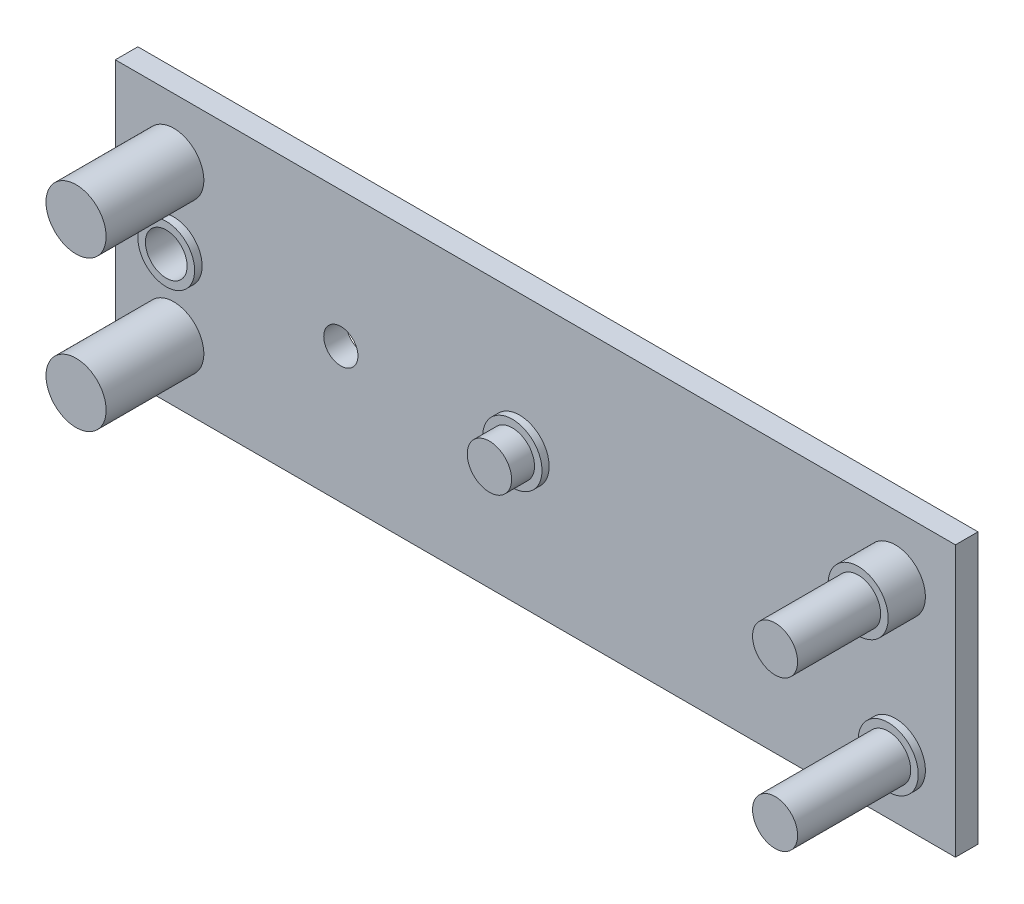
ISO-10303-21;
HEADER;
FILE_DESCRIPTION(('STEP AP214'),'2;1');
FILE_NAME('part.step','',(''),(''),'','','');
FILE_SCHEMA(('AUTOMOTIVE_DESIGN { 1 0 10303 214 1 1 1 1 }'));
ENDSEC;
DATA;
#1=APPLICATION_CONTEXT('core data for automotive mechanical design processes');
#2=APPLICATION_PROTOCOL_DEFINITION('international standard','automotive_design',2000,#1);
#3=PRODUCT_CONTEXT('',#1,'mechanical');
#4=PRODUCT('Part','Part','',(#3));
#5=PRODUCT_RELATED_PRODUCT_CATEGORY('part','',(#4));
#6=PRODUCT_DEFINITION_FORMATION('','',#4);
#7=PRODUCT_DEFINITION_CONTEXT('part definition',#1,'design');
#8=PRODUCT_DEFINITION('design','',#6,#7);
#9=PRODUCT_DEFINITION_SHAPE('','',#8);
#10=(LENGTH_UNIT() NAMED_UNIT(*) SI_UNIT(.MILLI.,.METRE.));
#11=(NAMED_UNIT(*) PLANE_ANGLE_UNIT() SI_UNIT($,.RADIAN.));
#12=(NAMED_UNIT(*) SI_UNIT($,.STERADIAN.) SOLID_ANGLE_UNIT());
#13=UNCERTAINTY_MEASURE_WITH_UNIT(LENGTH_MEASURE(1.E-05),#10,'distance_accuracy_value','');
#14=(GEOMETRIC_REPRESENTATION_CONTEXT(3) GLOBAL_UNCERTAINTY_ASSIGNED_CONTEXT((#13)) GLOBAL_UNIT_ASSIGNED_CONTEXT((#10,
#11,#12)) REPRESENTATION_CONTEXT('',''));
#15=CARTESIAN_POINT('',(0.,0.,0.));
#16=DIRECTION('',(0.,0.,1.));
#17=DIRECTION('',(1.,0.,0.));
#18=AXIS2_PLACEMENT_3D('',#15,#16,#17);
#19=CARTESIAN_POINT('',(0.,0.,3.));
#20=DIRECTION('',(0.,0.,1.));
#21=DIRECTION('',(1.,0.,0.));
#22=AXIS2_PLACEMENT_3D('',#19,#20,#21);
#23=PLANE('',#22);
#24=CARTESIAN_POINT('',(0.,10.,3.));
#25=DIRECTION('',(0.,0.,1.));
#26=DIRECTION('',(-1.,0.,0.));
#27=AXIS2_PLACEMENT_3D('',#24,#25,#26);
#28=CIRCLE('',#27,4.);
#29=CARTESIAN_POINT('',(-4.,10.,3.));
#30=VERTEX_POINT('',#29);
#31=EDGE_CURVE('E234',#30,#30,#28,.T.);
#32=ORIENTED_EDGE('',*,*,#31,.F.);
#33=EDGE_LOOP('',(#32));
#34=FACE_BOUND('',#33,.T.);
#35=CARTESIAN_POINT('',(0.,-10.,3.));
#36=DIRECTION('',(0.,0.,1.));
#37=DIRECTION('',(1.,0.,0.));
#38=AXIS2_PLACEMENT_3D('',#35,#36,#37);
#39=CIRCLE('',#38,4.);
#40=CARTESIAN_POINT('',(-4.,-10.,3.));
#41=VERTEX_POINT('',#40);
#42=EDGE_CURVE('E226',#41,#41,#39,.T.);
#43=ORIENTED_EDGE('',*,*,#42,.F.);
#44=EDGE_LOOP('',(#43));
#45=FACE_BOUND('',#44,.T.);
#46=DIRECTION('',(0.,-1.,0.));
#47=VECTOR('',#46,1.);
#48=CARTESIAN_POINT('',(-7.775,18.,3.));
#49=LINE('',#48,#47);
#50=CARTESIAN_POINT('',(-7.775,18.,3.));
#51=VERTEX_POINT('',#50);
#52=CARTESIAN_POINT('',(-7.775,-18.,3.));
#53=VERTEX_POINT('',#52);
#54=EDGE_CURVE('E100',#51,#53,#49,.T.);
#55=ORIENTED_EDGE('',*,*,#54,.T.);
#56=DIRECTION('',(1.,0.,0.));
#57=VECTOR('',#56,1.);
#58=CARTESIAN_POINT('',(-7.775,-18.,3.));
#59=LINE('',#58,#57);
#60=CARTESIAN_POINT('',(104.0099990002,-18.,3.));
#61=VERTEX_POINT('',#60);
#62=EDGE_CURVE('E95',#53,#61,#59,.T.);
#63=ORIENTED_EDGE('',*,*,#62,.T.);
#64=DIRECTION('',(0.,1.,0.));
#65=VECTOR('',#64,1.);
#66=CARTESIAN_POINT('',(104.0099990002,18.,3.));
#67=LINE('',#66,#65);
#68=CARTESIAN_POINT('',(104.0099990002,18.,3.));
#69=VERTEX_POINT('',#68);
#70=EDGE_CURVE('E98',#61,#69,#67,.T.);
#71=ORIENTED_EDGE('',*,*,#70,.T.);
#72=DIRECTION('',(-1.,0.,0.));
#73=VECTOR('',#72,1.);
#74=CARTESIAN_POINT('',(-7.775,18.,3.));
#75=LINE('',#74,#73);
#76=EDGE_CURVE('E65',#69,#51,#75,.T.);
#77=ORIENTED_EDGE('',*,*,#76,.T.);
#78=EDGE_LOOP('',(#55,#63,#71,#77));
#79=FACE_BOUND('',#78,.T.);
#80=CARTESIAN_POINT('',(46.,0.,3.));
#81=DIRECTION('',(0.,0.,1.));
#82=DIRECTION('',(1.,0.,0.));
#83=AXIS2_PLACEMENT_3D('',#80,#81,#82);
#84=CIRCLE('',#83,3.95);
#85=CARTESIAN_POINT('',(42.05,0.,3.));
#86=VERTEX_POINT('',#85);
#87=EDGE_CURVE('E141',#86,#86,#84,.T.);
#88=ORIENTED_EDGE('',*,*,#87,.F.);
#89=EDGE_LOOP('',(#88));
#90=FACE_BOUND('',#89,.T.);
#91=CARTESIAN_POINT('',(96.0099990002,-10.,3.));
#92=DIRECTION('',(0.,0.,1.));
#93=DIRECTION('',(1.,0.,0.));
#94=AXIS2_PLACEMENT_3D('',#91,#92,#93);
#95=CIRCLE('',#94,4.);
#96=CARTESIAN_POINT('',(92.0099990001999,-10.,3.));
#97=VERTEX_POINT('',#96);
#98=EDGE_CURVE('E151',#97,#97,#95,.T.);
#99=ORIENTED_EDGE('',*,*,#98,.F.);
#100=EDGE_LOOP('',(#99));
#101=FACE_BOUND('',#100,.T.);
#102=CARTESIAN_POINT('',(96.0099990002,10.,3.));
#103=DIRECTION('',(0.,0.,1.));
#104=DIRECTION('',(1.,0.,0.));
#105=AXIS2_PLACEMENT_3D('',#102,#103,#104);
#106=CIRCLE('',#105,4.);
#107=CARTESIAN_POINT('',(92.0099990001999,10.,3.));
#108=VERTEX_POINT('',#107);
#109=EDGE_CURVE('E160',#108,#108,#106,.T.);
#110=ORIENTED_EDGE('',*,*,#109,.F.);
#111=EDGE_LOOP('',(#110));
#112=FACE_BOUND('',#111,.T.);
#113=CARTESIAN_POINT('',(22.23,0.,3.));
#114=DIRECTION('',(0.,0.,1.));
#115=DIRECTION('',(1.,0.,0.));
#116=AXIS2_PLACEMENT_3D('',#113,#114,#115);
#117=CIRCLE('',#116,2.275);
#118=CARTESIAN_POINT('',(24.505,0.,3.));
#119=VERTEX_POINT('',#118);
#120=EDGE_CURVE('E205',#119,#119,#117,.F.);
#121=ORIENTED_EDGE('',*,*,#120,.T.);
#122=EDGE_LOOP('',(#121));
#123=FACE_BOUND('',#122,.T.);
#124=CARTESIAN_POINT('',(0.,0.,3.));
#125=DIRECTION('',(0.,0.,1.));
#126=DIRECTION('',(1.,0.,0.));
#127=AXIS2_PLACEMENT_3D('',#124,#125,#126);
#128=CIRCLE('',#127,3.775);
#129=CARTESIAN_POINT('',(3.775,0.,3.));
#130=VERTEX_POINT('',#129);
#131=EDGE_CURVE('E214',#130,#130,#128,.T.);
#132=ORIENTED_EDGE('',*,*,#131,.F.);
#133=EDGE_LOOP('',(#132));
#134=FACE_BOUND('',#133,.T.);
#135=ADVANCED_FACE('F45',(#34,#45,#79,#90,#101,#112,#123,#134),#23,.T.);
#136=CARTESIAN_POINT('',(0.,0.,0.));
#137=DIRECTION('',(0.,0.,1.));
#138=DIRECTION('',(1.,0.,0.));
#139=AXIS2_PLACEMENT_3D('',#136,#137,#138);
#140=PLANE('',#139);
#141=CARTESIAN_POINT('',(22.23,0.,0.));
#142=DIRECTION('',(0.,0.,-1.));
#143=DIRECTION('',(-1.,0.,0.));
#144=AXIS2_PLACEMENT_3D('',#141,#142,#143);
#145=CIRCLE('',#144,2.275);
#146=CARTESIAN_POINT('',(19.955,0.,0.));
#147=VERTEX_POINT('',#146);
#148=EDGE_CURVE('E202',#147,#147,#145,.T.);
#149=ORIENTED_EDGE('',*,*,#148,.F.);
#150=EDGE_LOOP('',(#149));
#151=FACE_BOUND('',#150,.T.);
#152=DIRECTION('',(0.,-1.,0.));
#153=VECTOR('',#152,1.);
#154=CARTESIAN_POINT('',(-7.775,18.,0.));
#155=LINE('',#154,#153);
#156=CARTESIAN_POINT('',(-7.775,18.,0.));
#157=VERTEX_POINT('',#156);
#158=CARTESIAN_POINT('',(-7.775,-18.,0.));
#159=VERTEX_POINT('',#158);
#160=EDGE_CURVE('E118',#157,#159,#155,.T.);
#161=ORIENTED_EDGE('',*,*,#160,.F.);
#162=DIRECTION('',(-1.,0.,0.));
#163=VECTOR('',#162,1.);
#164=CARTESIAN_POINT('',(-7.775,18.,0.));
#165=LINE('',#164,#163);
#166=CARTESIAN_POINT('',(104.0099990002,18.,0.));
#167=VERTEX_POINT('',#166);
#168=EDGE_CURVE('E88',#167,#157,#165,.T.);
#169=ORIENTED_EDGE('',*,*,#168,.F.);
#170=DIRECTION('',(0.,1.,0.));
#171=VECTOR('',#170,1.);
#172=CARTESIAN_POINT('',(104.0099990002,18.,0.));
#173=LINE('',#172,#171);
#174=CARTESIAN_POINT('',(104.0099990002,-18.,0.));
#175=VERTEX_POINT('',#174);
#176=EDGE_CURVE('E82',#175,#167,#173,.T.);
#177=ORIENTED_EDGE('',*,*,#176,.F.);
#178=DIRECTION('',(1.,0.,0.));
#179=VECTOR('',#178,1.);
#180=CARTESIAN_POINT('',(-7.775,-18.,0.));
#181=LINE('',#180,#179);
#182=EDGE_CURVE('E105',#159,#175,#181,.T.);
#183=ORIENTED_EDGE('',*,*,#182,.F.);
#184=EDGE_LOOP('',(#161,#169,#177,#183));
#185=FACE_BOUND('',#184,.T.);
#186=CARTESIAN_POINT('',(0.,0.,0.));
#187=DIRECTION('',(0.,0.,1.));
#188=DIRECTION('',(1.,0.,0.));
#189=AXIS2_PLACEMENT_3D('',#186,#187,#188);
#190=CIRCLE('',#189,2.775);
#191=CARTESIAN_POINT('',(2.775,0.,0.));
#192=VERTEX_POINT('',#191);
#193=EDGE_CURVE('E122',#192,#192,#190,.T.);
#194=ORIENTED_EDGE('',*,*,#193,.T.);
#195=EDGE_LOOP('',(#194));
#196=FACE_BOUND('',#195,.T.);
#197=ADVANCED_FACE('F257',(#151,#185,#196),#140,.F.);
#198=CARTESIAN_POINT('',(-7.775,18.,3.));
#199=DIRECTION('',(1.,0.,0.));
#200=DIRECTION('',(0.,0.,-1.));
#201=AXIS2_PLACEMENT_3D('',#198,#199,#200);
#202=PLANE('',#201);
#203=ORIENTED_EDGE('',*,*,#160,.T.);
#204=DIRECTION('',(0.,0.,-1.));
#205=VECTOR('',#204,1.);
#206=CARTESIAN_POINT('',(-7.775,-18.,3.));
#207=LINE('',#206,#205);
#208=EDGE_CURVE('E11',#53,#159,#207,.T.);
#209=ORIENTED_EDGE('',*,*,#208,.F.);
#210=ORIENTED_EDGE('',*,*,#54,.F.);
#211=DIRECTION('',(0.,0.,-1.));
#212=VECTOR('',#211,1.);
#213=CARTESIAN_POINT('',(-7.775,18.,3.));
#214=LINE('',#213,#212);
#215=EDGE_CURVE('E114',#51,#157,#214,.T.);
#216=ORIENTED_EDGE('',*,*,#215,.T.);
#217=EDGE_LOOP('',(#203,#209,#210,#216));
#218=FACE_BOUND('',#217,.T.);
#219=ADVANCED_FACE('F47',(#218),#202,.F.);
#220=CARTESIAN_POINT('',(-7.775,-18.,3.));
#221=DIRECTION('',(0.,1.,0.));
#222=DIRECTION('',(0.,0.,1.));
#223=AXIS2_PLACEMENT_3D('',#220,#221,#222);
#224=PLANE('',#223);
#225=ORIENTED_EDGE('',*,*,#182,.T.);
#226=DIRECTION('',(0.,0.,-1.));
#227=VECTOR('',#226,1.);
#228=CARTESIAN_POINT('',(104.0099990002,-18.,3.));
#229=LINE('',#228,#227);
#230=EDGE_CURVE('E56',#61,#175,#229,.T.);
#231=ORIENTED_EDGE('',*,*,#230,.F.);
#232=ORIENTED_EDGE('',*,*,#62,.F.);
#233=ORIENTED_EDGE('',*,*,#208,.T.);
#234=EDGE_LOOP('',(#225,#231,#232,#233));
#235=FACE_BOUND('',#234,.T.);
#236=ADVANCED_FACE('F104',(#235),#224,.F.);
#237=CARTESIAN_POINT('',(104.0099990002,18.,3.));
#238=DIRECTION('',(-1.,0.,0.));
#239=DIRECTION('',(0.,0.,1.));
#240=AXIS2_PLACEMENT_3D('',#237,#238,#239);
#241=PLANE('',#240);
#242=ORIENTED_EDGE('',*,*,#176,.T.);
#243=DIRECTION('',(0.,0.,-1.));
#244=VECTOR('',#243,1.);
#245=CARTESIAN_POINT('',(104.0099990002,18.,3.));
#246=LINE('',#245,#244);
#247=EDGE_CURVE('E107',#69,#167,#246,.T.);
#248=ORIENTED_EDGE('',*,*,#247,.F.);
#249=ORIENTED_EDGE('',*,*,#70,.F.);
#250=ORIENTED_EDGE('',*,*,#230,.T.);
#251=EDGE_LOOP('',(#242,#248,#249,#250));
#252=FACE_BOUND('',#251,.T.);
#253=ADVANCED_FACE('F109',(#252),#241,.F.);
#254=CARTESIAN_POINT('',(-7.775,18.,3.));
#255=DIRECTION('',(0.,-1.,0.));
#256=DIRECTION('',(0.,0.,-1.));
#257=AXIS2_PLACEMENT_3D('',#254,#255,#256);
#258=PLANE('',#257);
#259=ORIENTED_EDGE('',*,*,#168,.T.);
#260=ORIENTED_EDGE('',*,*,#215,.F.);
#261=ORIENTED_EDGE('',*,*,#76,.F.);
#262=ORIENTED_EDGE('',*,*,#247,.T.);
#263=EDGE_LOOP('',(#259,#260,#261,#262));
#264=FACE_BOUND('',#263,.T.);
#265=ADVANCED_FACE('F333',(#264),#258,.F.);
#266=CARTESIAN_POINT('',(0.,0.,3.));
#267=DIRECTION('',(0.,0.,-1.));
#268=DIRECTION('',(-1.,0.,0.));
#269=AXIS2_PLACEMENT_3D('',#266,#267,#268);
#270=CYLINDRICAL_SURFACE('',#269,2.775);
#271=ORIENTED_EDGE('',*,*,#193,.F.);
#272=EDGE_LOOP('',(#271));
#273=FACE_BOUND('',#272,.T.);
#274=CARTESIAN_POINT('',(0.,0.,4.));
#275=DIRECTION('',(0.,0.,1.));
#276=DIRECTION('',(1.,0.,0.));
#277=AXIS2_PLACEMENT_3D('',#274,#275,#276);
#278=CIRCLE('',#277,2.775);
#279=CARTESIAN_POINT('',(2.775,0.,4.));
#280=VERTEX_POINT('',#279);
#281=EDGE_CURVE('E218',#280,#280,#278,.T.);
#282=ORIENTED_EDGE('',*,*,#281,.T.);
#283=EDGE_LOOP('',(#282));
#284=FACE_BOUND('',#283,.T.);
#285=ADVANCED_FACE('F313',(#273,#284),#270,.F.);
#286=CARTESIAN_POINT('',(46.,0.,3.95));
#287=DIRECTION('',(0.,0.,-1.));
#288=DIRECTION('',(-1.,0.,0.));
#289=AXIS2_PLACEMENT_3D('',#286,#287,#288);
#290=CYLINDRICAL_SURFACE('',#289,3.95);
#291=CARTESIAN_POINT('',(46.,0.,3.95));
#292=DIRECTION('',(0.,0.,1.));
#293=DIRECTION('',(1.,0.,0.));
#294=AXIS2_PLACEMENT_3D('',#291,#292,#293);
#295=CIRCLE('',#294,3.95);
#296=CARTESIAN_POINT('',(42.05,0.,3.95));
#297=VERTEX_POINT('',#296);
#298=EDGE_CURVE('E137',#297,#297,#295,.T.);
#299=CARTESIAN_POINT('',(42.05,0.,3.95));
#300=CARTESIAN_POINT('',(42.05,0.,3.94010416666667));
#301=CARTESIAN_POINT('',(42.05,0.,3.93020833333333));
#302=CARTESIAN_POINT('',(42.05,0.,3.91041666666667));
#303=CARTESIAN_POINT('',(42.05,0.,3.90052083333333));
#304=CARTESIAN_POINT('',(42.05,0.,3.88072916666667));
#305=CARTESIAN_POINT('',(42.05,0.,3.87083333333333));
#306=CARTESIAN_POINT('',(42.05,0.,3.85104166666667));
#307=CARTESIAN_POINT('',(42.05,0.,3.84114583333333));
#308=CARTESIAN_POINT('',(42.05,0.,3.82135416666667));
#309=CARTESIAN_POINT('',(42.05,0.,3.81145833333333));
#310=CARTESIAN_POINT('',(42.05,0.,3.79166666666667));
#311=CARTESIAN_POINT('',(42.05,0.,3.78177083333333));
#312=CARTESIAN_POINT('',(42.05,0.,3.76197916666667));
#313=CARTESIAN_POINT('',(42.05,0.,3.75208333333333));
#314=CARTESIAN_POINT('',(42.05,0.,3.73229166666667));
#315=CARTESIAN_POINT('',(42.05,0.,3.72239583333333));
#316=CARTESIAN_POINT('',(42.05,0.,3.70260416666667));
#317=CARTESIAN_POINT('',(42.05,0.,3.69270833333333));
#318=CARTESIAN_POINT('',(42.05,0.,3.67291666666667));
#319=CARTESIAN_POINT('',(42.05,0.,3.66302083333333));
#320=CARTESIAN_POINT('',(42.05,0.,3.64322916666667));
#321=CARTESIAN_POINT('',(42.05,0.,3.63333333333333));
#322=CARTESIAN_POINT('',(42.05,0.,3.61354166666667));
#323=CARTESIAN_POINT('',(42.05,0.,3.60364583333333));
#324=CARTESIAN_POINT('',(42.05,0.,3.58385416666667));
#325=CARTESIAN_POINT('',(42.05,0.,3.57395833333333));
#326=CARTESIAN_POINT('',(42.05,0.,3.55416666666667));
#327=CARTESIAN_POINT('',(42.05,0.,3.54427083333333));
#328=CARTESIAN_POINT('',(42.05,0.,3.52447916666667));
#329=CARTESIAN_POINT('',(42.05,0.,3.51458333333333));
#330=CARTESIAN_POINT('',(42.05,0.,3.49479166666667));
#331=CARTESIAN_POINT('',(42.05,0.,3.48489583333333));
#332=CARTESIAN_POINT('',(42.05,0.,3.46510416666667));
#333=CARTESIAN_POINT('',(42.05,0.,3.45520833333333));
#334=CARTESIAN_POINT('',(42.05,0.,3.43541666666667));
#335=CARTESIAN_POINT('',(42.05,0.,3.42552083333333));
#336=CARTESIAN_POINT('',(42.05,0.,3.40572916666667));
#337=CARTESIAN_POINT('',(42.05,0.,3.39583333333333));
#338=CARTESIAN_POINT('',(42.05,0.,3.37604166666667));
#339=CARTESIAN_POINT('',(42.05,0.,3.36614583333333));
#340=CARTESIAN_POINT('',(42.05,0.,3.34635416666667));
#341=CARTESIAN_POINT('',(42.05,0.,3.33645833333333));
#342=CARTESIAN_POINT('',(42.05,0.,3.31666666666667));
#343=CARTESIAN_POINT('',(42.05,0.,3.30677083333333));
#344=CARTESIAN_POINT('',(42.05,0.,3.28697916666667));
#345=CARTESIAN_POINT('',(42.05,0.,3.27708333333333));
#346=CARTESIAN_POINT('',(42.05,0.,3.25729166666667));
#347=CARTESIAN_POINT('',(42.05,0.,3.24739583333333));
#348=CARTESIAN_POINT('',(42.05,0.,3.22760416666667));
#349=CARTESIAN_POINT('',(42.05,0.,3.21770833333333));
#350=CARTESIAN_POINT('',(42.05,0.,3.19791666666667));
#351=CARTESIAN_POINT('',(42.05,0.,3.18802083333333));
#352=CARTESIAN_POINT('',(42.05,0.,3.16822916666667));
#353=CARTESIAN_POINT('',(42.05,0.,3.15833333333333));
#354=CARTESIAN_POINT('',(42.05,0.,3.13854166666667));
#355=CARTESIAN_POINT('',(42.05,0.,3.12864583333333));
#356=CARTESIAN_POINT('',(42.05,0.,3.10885416666667));
#357=CARTESIAN_POINT('',(42.05,0.,3.09895833333333));
#358=CARTESIAN_POINT('',(42.05,0.,3.07916666666667));
#359=CARTESIAN_POINT('',(42.05,0.,3.06927083333333));
#360=CARTESIAN_POINT('',(42.05,0.,3.04947916666667));
#361=CARTESIAN_POINT('',(42.05,0.,3.03958333333333));
#362=CARTESIAN_POINT('',(42.05,0.,3.01979166666667));
#363=CARTESIAN_POINT('',(42.05,0.,3.00989583333333));
#364=CARTESIAN_POINT('',(42.05,0.,3.));
#365=B_SPLINE_CURVE_WITH_KNOTS('',3,(#299,#300,#301,#302,#303,#304,#305,#306,#307,#308,#309,
#310,#311,#312,#313,#314,#315,#316,#317,#318,#319,#320,#321,#322,#323,#324,#325,#326,#327,#328,
#329,#330,#331,#332,#333,#334,#335,#336,#337,#338,#339,#340,#341,#342,#343,#344,#345,#346,#347,
#348,#349,#350,#351,#352,#353,#354,#355,#356,#357,#358,#359,#360,#361,#362,#363,#364),
.UNSPECIFIED.,.F.,.F.,(4,2,2,2,2,2,2,2,2,2,2,2,2,2,2,2,2,2,2,2,2,2,2,2,2,2,2,2,2,2,2,2,4),(0.,
0.0296874999999993,0.0593749999999995,0.0890624999999997,0.118749999999999,0.1484375,
0.178124999999999,0.2078125,0.237499999999999,0.2671875,0.296874999999999,0.3265625,0.35625,
0.3859375,0.415625,0.4453125,0.475,0.5046875,0.534375,0.564062499999999,0.59375,0.6234375,
0.653125,0.6828125,0.7125,0.7421875,0.771875,0.8015625,0.831249999999999,0.8609375,0.890625,
0.9203125,0.95),.UNSPECIFIED.);
#366=EDGE_CURVE('BSEAM309',#297,#86,#365,.T.);
#367=ORIENTED_EDGE('',*,*,#298,.F.);
#368=ORIENTED_EDGE('',*,*,#87,.T.);
#369=ORIENTED_EDGE('',*,*,#366,.T.);
#370=ORIENTED_EDGE('',*,*,#366,.F.);
#371=EDGE_LOOP('',(#367,#369,#368,#370));
#372=FACE_BOUND('',#371,.T.);
#373=ADVANCED_FACE('F309',(#372),#290,.T.);
#374=CARTESIAN_POINT('',(46.,0.,3.95));
#375=DIRECTION('',(0.,0.,1.));
#376=DIRECTION('',(1.,0.,0.));
#377=AXIS2_PLACEMENT_3D('',#374,#375,#376);
#378=PLANE('',#377);
#379=CARTESIAN_POINT('',(46.,0.,3.95));
#380=DIRECTION('',(0.,0.,1.));
#381=DIRECTION('',(1.,0.,0.));
#382=AXIS2_PLACEMENT_3D('',#379,#380,#381);
#383=CIRCLE('',#382,2.95);
#384=CARTESIAN_POINT('',(48.95,0.,3.95));
#385=VERTEX_POINT('',#384);
#386=EDGE_CURVE('E133',#385,#385,#383,.T.);
#387=ORIENTED_EDGE('',*,*,#386,.F.);
#388=EDGE_LOOP('',(#387));
#389=FACE_BOUND('',#388,.T.);
#390=ORIENTED_EDGE('',*,*,#298,.T.);
#391=EDGE_LOOP('',(#390));
#392=FACE_BOUND('',#391,.T.);
#393=ADVANCED_FACE('F305',(#389,#392),#378,.T.);
#394=CARTESIAN_POINT('',(46.,0.,7.));
#395=DIRECTION('',(0.,0.,1.));
#396=DIRECTION('',(1.,0.,0.));
#397=AXIS2_PLACEMENT_3D('',#394,#395,#396);
#398=PLANE('',#397);
#399=CARTESIAN_POINT('',(46.,0.,7.));
#400=DIRECTION('',(0.,0.,1.));
#401=DIRECTION('',(1.,0.,0.));
#402=AXIS2_PLACEMENT_3D('',#399,#400,#401);
#403=CIRCLE('',#402,2.95);
#404=CARTESIAN_POINT('',(48.95,0.,7.));
#405=VERTEX_POINT('',#404);
#406=EDGE_CURVE('E136',#405,#405,#403,.T.);
#407=ORIENTED_EDGE('',*,*,#406,.T.);
#408=EDGE_LOOP('',(#407));
#409=FACE_BOUND('',#408,.T.);
#410=ADVANCED_FACE('F308',(#409),#398,.T.);
#411=CARTESIAN_POINT('',(46.,0.,7.));
#412=DIRECTION('',(0.,0.,-1.));
#413=DIRECTION('',(-1.,0.,0.));
#414=AXIS2_PLACEMENT_3D('',#411,#412,#413);
#415=CYLINDRICAL_SURFACE('',#414,2.95);
#416=ORIENTED_EDGE('',*,*,#386,.T.);
#417=EDGE_LOOP('',(#416));
#418=FACE_BOUND('',#417,.T.);
#419=ORIENTED_EDGE('',*,*,#406,.F.);
#420=EDGE_LOOP('',(#419));
#421=FACE_BOUND('',#420,.T.);
#422=ADVANCED_FACE('F303',(#418,#421),#415,.T.);
#423=CARTESIAN_POINT('',(96.0099990002,-10.,3.95));
#424=DIRECTION('',(0.,0.,-1.));
#425=DIRECTION('',(-1.,0.,0.));
#426=AXIS2_PLACEMENT_3D('',#423,#424,#425);
#427=CYLINDRICAL_SURFACE('',#426,4.);
#428=CARTESIAN_POINT('',(96.0099990002,-10.,3.95));
#429=DIRECTION('',(0.,0.,1.));
#430=DIRECTION('',(1.,0.,0.));
#431=AXIS2_PLACEMENT_3D('',#428,#429,#430);
#432=CIRCLE('',#431,4.);
#433=CARTESIAN_POINT('',(92.0099990001999,-10.,3.95));
#434=VERTEX_POINT('',#433);
#435=EDGE_CURVE('E142',#434,#434,#432,.T.);
#436=CARTESIAN_POINT('',(92.0099990001999,-10.,3.95));
#437=CARTESIAN_POINT('',(92.0099990001999,-10.,3.94010416666667));
#438=CARTESIAN_POINT('',(92.0099990001999,-10.,3.93020833333333));
#439=CARTESIAN_POINT('',(92.0099990001999,-10.,3.91041666666667));
#440=CARTESIAN_POINT('',(92.0099990001999,-10.,3.90052083333333));
#441=CARTESIAN_POINT('',(92.0099990001999,-10.,3.88072916666667));
#442=CARTESIAN_POINT('',(92.0099990001999,-10.,3.87083333333333));
#443=CARTESIAN_POINT('',(92.0099990001999,-10.,3.85104166666667));
#444=CARTESIAN_POINT('',(92.0099990001999,-10.,3.84114583333333));
#445=CARTESIAN_POINT('',(92.0099990001999,-10.,3.82135416666667));
#446=CARTESIAN_POINT('',(92.0099990001999,-10.,3.81145833333333));
#447=CARTESIAN_POINT('',(92.0099990001999,-10.,3.79166666666667));
#448=CARTESIAN_POINT('',(92.0099990001999,-10.,3.78177083333333));
#449=CARTESIAN_POINT('',(92.0099990001999,-10.,3.76197916666667));
#450=CARTESIAN_POINT('',(92.0099990001999,-10.,3.75208333333333));
#451=CARTESIAN_POINT('',(92.0099990001999,-10.,3.73229166666667));
#452=CARTESIAN_POINT('',(92.0099990001999,-10.,3.72239583333333));
#453=CARTESIAN_POINT('',(92.0099990001999,-10.,3.70260416666667));
#454=CARTESIAN_POINT('',(92.0099990001999,-10.,3.69270833333333));
#455=CARTESIAN_POINT('',(92.0099990001999,-10.,3.67291666666667));
#456=CARTESIAN_POINT('',(92.0099990001999,-10.,3.66302083333333));
#457=CARTESIAN_POINT('',(92.0099990001999,-10.,3.64322916666667));
#458=CARTESIAN_POINT('',(92.0099990001999,-10.,3.63333333333333));
#459=CARTESIAN_POINT('',(92.0099990001999,-10.,3.61354166666667));
#460=CARTESIAN_POINT('',(92.0099990001999,-10.,3.60364583333333));
#461=CARTESIAN_POINT('',(92.0099990001999,-10.,3.58385416666667));
#462=CARTESIAN_POINT('',(92.0099990001999,-10.,3.57395833333333));
#463=CARTESIAN_POINT('',(92.0099990001999,-10.,3.55416666666667));
#464=CARTESIAN_POINT('',(92.0099990001999,-10.,3.54427083333333));
#465=CARTESIAN_POINT('',(92.0099990001999,-10.,3.52447916666667));
#466=CARTESIAN_POINT('',(92.0099990001999,-10.,3.51458333333333));
#467=CARTESIAN_POINT('',(92.0099990001999,-10.,3.49479166666667));
#468=CARTESIAN_POINT('',(92.0099990001999,-10.,3.48489583333333));
#469=CARTESIAN_POINT('',(92.0099990001999,-10.,3.46510416666667));
#470=CARTESIAN_POINT('',(92.0099990001999,-10.,3.45520833333333));
#471=CARTESIAN_POINT('',(92.0099990001999,-10.,3.43541666666667));
#472=CARTESIAN_POINT('',(92.0099990001999,-10.,3.42552083333333));
#473=CARTESIAN_POINT('',(92.0099990001999,-10.,3.40572916666667));
#474=CARTESIAN_POINT('',(92.0099990001999,-10.,3.39583333333333));
#475=CARTESIAN_POINT('',(92.0099990001999,-10.,3.37604166666667));
#476=CARTESIAN_POINT('',(92.0099990001999,-10.,3.36614583333333));
#477=CARTESIAN_POINT('',(92.0099990001999,-10.,3.34635416666667));
#478=CARTESIAN_POINT('',(92.0099990001999,-10.,3.33645833333333));
#479=CARTESIAN_POINT('',(92.0099990001999,-10.,3.31666666666667));
#480=CARTESIAN_POINT('',(92.0099990001999,-10.,3.30677083333333));
#481=CARTESIAN_POINT('',(92.0099990001999,-10.,3.28697916666667));
#482=CARTESIAN_POINT('',(92.0099990001999,-10.,3.27708333333333));
#483=CARTESIAN_POINT('',(92.0099990001999,-10.,3.25729166666667));
#484=CARTESIAN_POINT('',(92.0099990001999,-10.,3.24739583333333));
#485=CARTESIAN_POINT('',(92.0099990001999,-10.,3.22760416666667));
#486=CARTESIAN_POINT('',(92.0099990001999,-10.,3.21770833333333));
#487=CARTESIAN_POINT('',(92.0099990001999,-10.,3.19791666666667));
#488=CARTESIAN_POINT('',(92.0099990001999,-10.,3.18802083333333));
#489=CARTESIAN_POINT('',(92.0099990001999,-10.,3.16822916666667));
#490=CARTESIAN_POINT('',(92.0099990001999,-10.,3.15833333333333));
#491=CARTESIAN_POINT('',(92.0099990001999,-10.,3.13854166666667));
#492=CARTESIAN_POINT('',(92.0099990001999,-10.,3.12864583333333));
#493=CARTESIAN_POINT('',(92.0099990001999,-10.,3.10885416666667));
#494=CARTESIAN_POINT('',(92.0099990001999,-10.,3.09895833333333));
#495=CARTESIAN_POINT('',(92.0099990001999,-10.,3.07916666666667));
#496=CARTESIAN_POINT('',(92.0099990001999,-10.,3.06927083333333));
#497=CARTESIAN_POINT('',(92.0099990001999,-10.,3.04947916666667));
#498=CARTESIAN_POINT('',(92.0099990001999,-10.,3.03958333333333));
#499=CARTESIAN_POINT('',(92.0099990001999,-10.,3.01979166666667));
#500=CARTESIAN_POINT('',(92.0099990001999,-10.,3.00989583333333));
#501=CARTESIAN_POINT('',(92.0099990001999,-10.,3.));
#502=B_SPLINE_CURVE_WITH_KNOTS('',3,(#436,#437,#438,#439,#440,#441,#442,#443,#444,#445,#446,
#447,#448,#449,#450,#451,#452,#453,#454,#455,#456,#457,#458,#459,#460,#461,#462,#463,#464,#465,
#466,#467,#468,#469,#470,#471,#472,#473,#474,#475,#476,#477,#478,#479,#480,#481,#482,#483,#484,
#485,#486,#487,#488,#489,#490,#491,#492,#493,#494,#495,#496,#497,#498,#499,#500,#501),
.UNSPECIFIED.,.F.,.F.,(4,2,2,2,2,2,2,2,2,2,2,2,2,2,2,2,2,2,2,2,2,2,2,2,2,2,2,2,2,2,2,2,4),(0.,
0.0296874999999993,0.0593749999999995,0.0890624999999997,0.118749999999999,0.1484375,
0.178124999999999,0.2078125,0.237499999999999,0.2671875,0.296874999999999,0.3265625,0.35625,
0.3859375,0.415625,0.4453125,0.475,0.5046875,0.534375,0.564062499999999,0.59375,0.6234375,
0.653125,0.6828125,0.7125,0.7421875,0.771875,0.8015625,0.831249999999999,0.8609375,0.890625,
0.9203125,0.95),.UNSPECIFIED.);
#503=EDGE_CURVE('BSEAM299',#434,#97,#502,.T.);
#504=ORIENTED_EDGE('',*,*,#435,.F.);
#505=ORIENTED_EDGE('',*,*,#98,.T.);
#506=ORIENTED_EDGE('',*,*,#503,.T.);
#507=ORIENTED_EDGE('',*,*,#503,.F.);
#508=EDGE_LOOP('',(#504,#506,#505,#507));
#509=FACE_BOUND('',#508,.T.);
#510=ADVANCED_FACE('F299',(#509),#427,.T.);
#511=CARTESIAN_POINT('',(96.0099990002,-10.,3.95));
#512=DIRECTION('',(0.,0.,1.));
#513=DIRECTION('',(1.,0.,0.));
#514=AXIS2_PLACEMENT_3D('',#511,#512,#513);
#515=PLANE('',#514);
#516=CARTESIAN_POINT('',(96.0099990002,-10.,3.95));
#517=DIRECTION('',(0.,0.,1.));
#518=DIRECTION('',(1.,0.,0.));
#519=AXIS2_PLACEMENT_3D('',#516,#517,#518);
#520=CIRCLE('',#519,3.00000000000001);
#521=CARTESIAN_POINT('',(99.0099990002,-10.,3.95));
#522=VERTEX_POINT('',#521);
#523=EDGE_CURVE('E138',#522,#522,#520,.T.);
#524=ORIENTED_EDGE('',*,*,#523,.F.);
#525=EDGE_LOOP('',(#524));
#526=FACE_BOUND('',#525,.T.);
#527=ORIENTED_EDGE('',*,*,#435,.T.);
#528=EDGE_LOOP('',(#527));
#529=FACE_BOUND('',#528,.T.);
#530=ADVANCED_FACE('F295',(#526,#529),#515,.T.);
#531=CARTESIAN_POINT('',(96.0099990002,-10.,19.));
#532=DIRECTION('',(0.,0.,1.));
#533=DIRECTION('',(1.,0.,0.));
#534=AXIS2_PLACEMENT_3D('',#531,#532,#533);
#535=PLANE('',#534);
#536=CARTESIAN_POINT('',(96.0099990002,-10.,19.));
#537=DIRECTION('',(0.,0.,1.));
#538=DIRECTION('',(1.,0.,0.));
#539=AXIS2_PLACEMENT_3D('',#536,#537,#538);
#540=CIRCLE('',#539,3.00000000000001);
#541=CARTESIAN_POINT('',(99.0099990002,-10.,19.));
#542=VERTEX_POINT('',#541);
#543=EDGE_CURVE('E173',#542,#542,#540,.T.);
#544=ORIENTED_EDGE('',*,*,#543,.T.);
#545=EDGE_LOOP('',(#544));
#546=FACE_BOUND('',#545,.T.);
#547=ADVANCED_FACE('F298',(#546),#535,.T.);
#548=CARTESIAN_POINT('',(96.0099990002,-10.,19.));
#549=DIRECTION('',(0.,0.,-1.));
#550=DIRECTION('',(-1.,0.,0.));
#551=AXIS2_PLACEMENT_3D('',#548,#549,#550);
#552=CYLINDRICAL_SURFACE('',#551,3.00000000000001);
#553=ORIENTED_EDGE('',*,*,#523,.T.);
#554=EDGE_LOOP('',(#553));
#555=FACE_BOUND('',#554,.T.);
#556=ORIENTED_EDGE('',*,*,#543,.F.);
#557=EDGE_LOOP('',(#556));
#558=FACE_BOUND('',#557,.T.);
#559=ADVANCED_FACE('F293',(#555,#558),#552,.T.);
#560=CARTESIAN_POINT('',(96.0099990002,10.,7.95));
#561=DIRECTION('',(0.,0.,-1.));
#562=DIRECTION('',(-1.,0.,0.));
#563=AXIS2_PLACEMENT_3D('',#560,#561,#562);
#564=CYLINDRICAL_SURFACE('',#563,4.);
#565=CARTESIAN_POINT('',(96.0099990002,10.,7.95));
#566=DIRECTION('',(0.,0.,1.));
#567=DIRECTION('',(1.,0.,0.));
#568=AXIS2_PLACEMENT_3D('',#565,#566,#567);
#569=CIRCLE('',#568,4.);
#570=CARTESIAN_POINT('',(92.0099990001999,10.,7.95));
#571=VERTEX_POINT('',#570);
#572=EDGE_CURVE('E242',#571,#571,#569,.T.);
#573=CARTESIAN_POINT('',(92.0099990001999,10.,7.95));
#574=CARTESIAN_POINT('',(92.0099990001999,10.,7.8984375));
#575=CARTESIAN_POINT('',(92.0099990001999,10.,7.846875));
#576=CARTESIAN_POINT('',(92.0099990001999,10.,7.74375));
#577=CARTESIAN_POINT('',(92.0099990001999,10.,7.6921875));
#578=CARTESIAN_POINT('',(92.0099990001999,10.,7.5890625));
#579=CARTESIAN_POINT('',(92.0099990001999,10.,7.5375));
#580=CARTESIAN_POINT('',(92.0099990001999,10.,7.434375));
#581=CARTESIAN_POINT('',(92.0099990001999,10.,7.3828125));
#582=CARTESIAN_POINT('',(92.0099990001999,10.,7.2796875));
#583=CARTESIAN_POINT('',(92.0099990001999,10.,7.228125));
#584=CARTESIAN_POINT('',(92.0099990001999,10.,7.125));
#585=CARTESIAN_POINT('',(92.0099990001999,10.,7.0734375));
#586=CARTESIAN_POINT('',(92.0099990001999,10.,6.9703125));
#587=CARTESIAN_POINT('',(92.0099990001999,10.,6.91875));
#588=CARTESIAN_POINT('',(92.0099990001999,10.,6.815625));
#589=CARTESIAN_POINT('',(92.0099990001999,10.,6.7640625));
#590=CARTESIAN_POINT('',(92.0099990001999,10.,6.6609375));
#591=CARTESIAN_POINT('',(92.0099990001999,10.,6.609375));
#592=CARTESIAN_POINT('',(92.0099990001999,10.,6.50625));
#593=CARTESIAN_POINT('',(92.0099990001999,10.,6.4546875));
#594=CARTESIAN_POINT('',(92.0099990001999,10.,6.3515625));
#595=CARTESIAN_POINT('',(92.0099990001999,10.,6.3));
#596=CARTESIAN_POINT('',(92.0099990001999,10.,6.196875));
#597=CARTESIAN_POINT('',(92.0099990001999,10.,6.1453125));
#598=CARTESIAN_POINT('',(92.0099990001999,10.,6.0421875));
#599=CARTESIAN_POINT('',(92.0099990001999,10.,5.990625));
#600=CARTESIAN_POINT('',(92.0099990001999,10.,5.8875));
#601=CARTESIAN_POINT('',(92.0099990001999,10.,5.8359375));
#602=CARTESIAN_POINT('',(92.0099990001999,10.,5.7328125));
#603=CARTESIAN_POINT('',(92.0099990001999,10.,5.68125));
#604=CARTESIAN_POINT('',(92.0099990001999,10.,5.578125));
#605=CARTESIAN_POINT('',(92.0099990001999,10.,5.5265625));
#606=CARTESIAN_POINT('',(92.0099990001999,10.,5.4234375));
#607=CARTESIAN_POINT('',(92.0099990001999,10.,5.371875));
#608=CARTESIAN_POINT('',(92.0099990001999,10.,5.26875));
#609=CARTESIAN_POINT('',(92.0099990001999,10.,5.2171875));
#610=CARTESIAN_POINT('',(92.0099990001999,10.,5.1140625));
#611=CARTESIAN_POINT('',(92.0099990001999,10.,5.0625));
#612=CARTESIAN_POINT('',(92.0099990001999,10.,4.959375));
#613=CARTESIAN_POINT('',(92.0099990001999,10.,4.9078125));
#614=CARTESIAN_POINT('',(92.0099990001999,10.,4.8046875));
#615=CARTESIAN_POINT('',(92.0099990001999,10.,4.753125));
#616=CARTESIAN_POINT('',(92.0099990001999,10.,4.65));
#617=CARTESIAN_POINT('',(92.0099990001999,10.,4.5984375));
#618=CARTESIAN_POINT('',(92.0099990001999,10.,4.4953125));
#619=CARTESIAN_POINT('',(92.0099990001999,10.,4.44375));
#620=CARTESIAN_POINT('',(92.0099990001999,10.,4.340625));
#621=CARTESIAN_POINT('',(92.0099990001999,10.,4.2890625));
#622=CARTESIAN_POINT('',(92.0099990001999,10.,4.1859375));
#623=CARTESIAN_POINT('',(92.0099990001999,10.,4.134375));
#624=CARTESIAN_POINT('',(92.0099990001999,10.,4.03125));
#625=CARTESIAN_POINT('',(92.0099990001999,10.,3.9796875));
#626=CARTESIAN_POINT('',(92.0099990001999,10.,3.8765625));
#627=CARTESIAN_POINT('',(92.0099990001999,10.,3.825));
#628=CARTESIAN_POINT('',(92.0099990001999,10.,3.721875));
#629=CARTESIAN_POINT('',(92.0099990001999,10.,3.6703125));
#630=CARTESIAN_POINT('',(92.0099990001999,10.,3.5671875));
#631=CARTESIAN_POINT('',(92.0099990001999,10.,3.515625));
#632=CARTESIAN_POINT('',(92.0099990001999,10.,3.4125));
#633=CARTESIAN_POINT('',(92.0099990001999,10.,3.3609375));
#634=CARTESIAN_POINT('',(92.0099990001999,10.,3.2578125));
#635=CARTESIAN_POINT('',(92.0099990001999,10.,3.20625));
#636=CARTESIAN_POINT('',(92.0099990001999,10.,3.103125));
#637=CARTESIAN_POINT('',(92.0099990001999,10.,3.0515625));
#638=CARTESIAN_POINT('',(92.0099990001999,10.,3.));
#639=B_SPLINE_CURVE_WITH_KNOTS('',3,(#573,#574,#575,#576,#577,#578,#579,#580,#581,#582,#583,
#584,#585,#586,#587,#588,#589,#590,#591,#592,#593,#594,#595,#596,#597,#598,#599,#600,#601,#602,
#603,#604,#605,#606,#607,#608,#609,#610,#611,#612,#613,#614,#615,#616,#617,#618,#619,#620,#621,
#622,#623,#624,#625,#626,#627,#628,#629,#630,#631,#632,#633,#634,#635,#636,#637,#638),
.UNSPECIFIED.,.F.,.F.,(4,2,2,2,2,2,2,2,2,2,2,2,2,2,2,2,2,2,2,2,2,2,2,2,2,2,2,2,2,2,2,2,4),(0.,
0.154687500000001,0.309375000000001,0.464062500000001,0.618750000000001,0.773437500000001,
0.928125000000001,1.0828125,1.2375,1.3921875,1.546875,1.7015625,1.85625,2.0109375,2.165625,
2.3203125,2.475,2.6296875,2.784375,2.9390625,3.09375,3.2484375,3.403125,3.5578125,3.7125,
3.8671875,4.021875,4.1765625,4.33125,4.4859375,4.640625,4.7953125,4.95),.UNSPECIFIED.);
#640=EDGE_CURVE('BSEAM253',#571,#108,#639,.T.);
#641=ORIENTED_EDGE('',*,*,#572,.F.);
#642=ORIENTED_EDGE('',*,*,#109,.T.);
#643=ORIENTED_EDGE('',*,*,#640,.T.);
#644=ORIENTED_EDGE('',*,*,#640,.F.);
#645=EDGE_LOOP('',(#641,#643,#642,#644));
#646=FACE_BOUND('',#645,.T.);
#647=ADVANCED_FACE('F253',(#646),#564,.T.);
#648=CARTESIAN_POINT('',(96.0099990002,10.,7.95));
#649=DIRECTION('',(0.,0.,1.));
#650=DIRECTION('',(1.,0.,0.));
#651=AXIS2_PLACEMENT_3D('',#648,#649,#650);
#652=PLANE('',#651);
#653=CARTESIAN_POINT('',(96.0099990002,10.,7.95));
#654=DIRECTION('',(0.,0.,1.));
#655=DIRECTION('',(1.,0.,0.));
#656=AXIS2_PLACEMENT_3D('',#653,#654,#655);
#657=CIRCLE('',#656,3.00000000000001);
#658=CARTESIAN_POINT('',(99.0099990002,10.,7.95));
#659=VERTEX_POINT('',#658);
#660=EDGE_CURVE('E49',#659,#659,#657,.T.);
#661=ORIENTED_EDGE('',*,*,#660,.F.);
#662=EDGE_LOOP('',(#661));
#663=FACE_BOUND('',#662,.T.);
#664=ORIENTED_EDGE('',*,*,#572,.T.);
#665=EDGE_LOOP('',(#664));
#666=FACE_BOUND('',#665,.T.);
#667=ADVANCED_FACE('F286',(#663,#666),#652,.T.);
#668=CARTESIAN_POINT('',(96.0099990002,10.,19.));
#669=DIRECTION('',(0.,0.,1.));
#670=DIRECTION('',(1.,0.,0.));
#671=AXIS2_PLACEMENT_3D('',#668,#669,#670);
#672=PLANE('',#671);
#673=CARTESIAN_POINT('',(96.0099990002,10.,19.));
#674=DIRECTION('',(0.,0.,1.));
#675=DIRECTION('',(1.,0.,0.));
#676=AXIS2_PLACEMENT_3D('',#673,#674,#675);
#677=CIRCLE('',#676,3.00000000000001);
#678=CARTESIAN_POINT('',(99.0099990002,10.,19.));
#679=VERTEX_POINT('',#678);
#680=EDGE_CURVE('E169',#679,#679,#677,.T.);
#681=ORIENTED_EDGE('',*,*,#680,.T.);
#682=EDGE_LOOP('',(#681));
#683=FACE_BOUND('',#682,.T.);
#684=ADVANCED_FACE('F289',(#683),#672,.T.);
#685=CARTESIAN_POINT('',(96.0099990002,10.,19.));
#686=DIRECTION('',(0.,0.,-1.));
#687=DIRECTION('',(-1.,0.,0.));
#688=AXIS2_PLACEMENT_3D('',#685,#686,#687);
#689=CYLINDRICAL_SURFACE('',#688,3.00000000000001);
#690=ORIENTED_EDGE('',*,*,#660,.T.);
#691=EDGE_LOOP('',(#690));
#692=FACE_BOUND('',#691,.T.);
#693=ORIENTED_EDGE('',*,*,#680,.F.);
#694=EDGE_LOOP('',(#693));
#695=FACE_BOUND('',#694,.T.);
#696=ADVANCED_FACE('F284',(#692,#695),#689,.T.);
#697=CARTESIAN_POINT('',(22.23,0.,9.43467170879758));
#698=DIRECTION('',(0.,0.,-1.));
#699=DIRECTION('',(-1.,0.,0.));
#700=AXIS2_PLACEMENT_3D('',#697,#698,#699);
#701=CYLINDRICAL_SURFACE('',#700,2.275);
#702=ORIENTED_EDGE('',*,*,#148,.T.);
#703=EDGE_LOOP('',(#702));
#704=FACE_BOUND('',#703,.T.);
#705=ORIENTED_EDGE('',*,*,#120,.F.);
#706=EDGE_LOOP('',(#705));
#707=FACE_BOUND('',#706,.T.);
#708=ADVANCED_FACE('F277',(#704,#707),#701,.F.);
#709=CARTESIAN_POINT('',(0.,0.,4.));
#710=DIRECTION('',(0.,0.,1.));
#711=DIRECTION('',(1.,0.,0.));
#712=AXIS2_PLACEMENT_3D('',#709,#710,#711);
#713=PLANE('',#712);
#714=CARTESIAN_POINT('',(0.,0.,4.));
#715=DIRECTION('',(0.,0.,1.));
#716=DIRECTION('',(1.,0.,0.));
#717=AXIS2_PLACEMENT_3D('',#714,#715,#716);
#718=CIRCLE('',#717,3.775);
#719=CARTESIAN_POINT('',(3.775,0.,4.));
#720=VERTEX_POINT('',#719);
#721=EDGE_CURVE('E206',#720,#720,#718,.T.);
#722=ORIENTED_EDGE('',*,*,#721,.T.);
#723=EDGE_LOOP('',(#722));
#724=FACE_BOUND('',#723,.T.);
#725=ORIENTED_EDGE('',*,*,#281,.F.);
#726=EDGE_LOOP('',(#725));
#727=FACE_BOUND('',#726,.T.);
#728=ADVANCED_FACE('F267',(#724,#727),#713,.T.);
#729=CARTESIAN_POINT('',(0.,0.,4.));
#730=DIRECTION('',(0.,0.,-1.));
#731=DIRECTION('',(-1.,0.,0.));
#732=AXIS2_PLACEMENT_3D('',#729,#730,#731);
#733=CYLINDRICAL_SURFACE('',#732,3.775);
#734=ORIENTED_EDGE('',*,*,#721,.F.);
#735=EDGE_LOOP('',(#734));
#736=FACE_BOUND('',#735,.T.);
#737=ORIENTED_EDGE('',*,*,#131,.T.);
#738=EDGE_LOOP('',(#737));
#739=FACE_BOUND('',#738,.T.);
#740=ADVANCED_FACE('F264',(#736,#739),#733,.T.);
#741=CARTESIAN_POINT('',(0.,-10.,16.));
#742=DIRECTION('',(0.,0.,-1.));
#743=DIRECTION('',(-1.,0.,0.));
#744=AXIS2_PLACEMENT_3D('',#741,#742,#743);
#745=CYLINDRICAL_SURFACE('',#744,4.);
#746=CARTESIAN_POINT('',(0.,-10.,16.));
#747=DIRECTION('',(0.,0.,1.));
#748=DIRECTION('',(1.,0.,0.));
#749=AXIS2_PLACEMENT_3D('',#746,#747,#748);
#750=CIRCLE('',#749,4.);
#751=CARTESIAN_POINT('',(-4.,-10.,16.));
#752=VERTEX_POINT('',#751);
#753=EDGE_CURVE('E222',#752,#752,#750,.T.);
#754=CARTESIAN_POINT('',(-4.,-10.,16.));
#755=CARTESIAN_POINT('',(-4.,-10.,15.8645833333333));
#756=CARTESIAN_POINT('',(-4.,-10.,15.7291666666667));
#757=CARTESIAN_POINT('',(-4.,-10.,15.4583333333333));
#758=CARTESIAN_POINT('',(-4.,-10.,15.3229166666667));
#759=CARTESIAN_POINT('',(-4.,-10.,15.0520833333333));
#760=CARTESIAN_POINT('',(-4.,-10.,14.9166666666667));
#761=CARTESIAN_POINT('',(-4.,-10.,14.6458333333333));
#762=CARTESIAN_POINT('',(-4.,-10.,14.5104166666667));
#763=CARTESIAN_POINT('',(-4.,-10.,14.2395833333333));
#764=CARTESIAN_POINT('',(-4.,-10.,14.1041666666667));
#765=CARTESIAN_POINT('',(-4.,-10.,13.8333333333333));
#766=CARTESIAN_POINT('',(-4.,-10.,13.6979166666667));
#767=CARTESIAN_POINT('',(-4.,-10.,13.4270833333333));
#768=CARTESIAN_POINT('',(-4.,-10.,13.2916666666667));
#769=CARTESIAN_POINT('',(-4.,-10.,13.0208333333333));
#770=CARTESIAN_POINT('',(-4.,-10.,12.8854166666667));
#771=CARTESIAN_POINT('',(-4.,-10.,12.6145833333333));
#772=CARTESIAN_POINT('',(-4.,-10.,12.4791666666667));
#773=CARTESIAN_POINT('',(-4.,-10.,12.2083333333333));
#774=CARTESIAN_POINT('',(-4.,-10.,12.0729166666667));
#775=CARTESIAN_POINT('',(-4.,-10.,11.8020833333333));
#776=CARTESIAN_POINT('',(-4.,-10.,11.6666666666667));
#777=CARTESIAN_POINT('',(-4.,-10.,11.3958333333333));
#778=CARTESIAN_POINT('',(-4.,-10.,11.2604166666667));
#779=CARTESIAN_POINT('',(-4.,-10.,10.9895833333333));
#780=CARTESIAN_POINT('',(-4.,-10.,10.8541666666667));
#781=CARTESIAN_POINT('',(-4.,-10.,10.5833333333333));
#782=CARTESIAN_POINT('',(-4.,-10.,10.4479166666667));
#783=CARTESIAN_POINT('',(-4.,-10.,10.1770833333333));
#784=CARTESIAN_POINT('',(-4.,-10.,10.0416666666667));
#785=CARTESIAN_POINT('',(-4.,-10.,9.77083333333333));
#786=CARTESIAN_POINT('',(-4.,-10.,9.63541666666667));
#787=CARTESIAN_POINT('',(-4.,-10.,9.36458333333333));
#788=CARTESIAN_POINT('',(-4.,-10.,9.22916666666667));
#789=CARTESIAN_POINT('',(-4.,-10.,8.95833333333333));
#790=CARTESIAN_POINT('',(-4.,-10.,8.82291666666667));
#791=CARTESIAN_POINT('',(-4.,-10.,8.55208333333333));
#792=CARTESIAN_POINT('',(-4.,-10.,8.41666666666667));
#793=CARTESIAN_POINT('',(-4.,-10.,8.14583333333333));
#794=CARTESIAN_POINT('',(-4.,-10.,8.01041666666667));
#795=CARTESIAN_POINT('',(-4.,-10.,7.73958333333333));
#796=CARTESIAN_POINT('',(-4.,-10.,7.60416666666667));
#797=CARTESIAN_POINT('',(-4.,-10.,7.33333333333333));
#798=CARTESIAN_POINT('',(-4.,-10.,7.19791666666667));
#799=CARTESIAN_POINT('',(-4.,-10.,6.92708333333333));
#800=CARTESIAN_POINT('',(-4.,-10.,6.79166666666667));
#801=CARTESIAN_POINT('',(-4.,-10.,6.52083333333333));
#802=CARTESIAN_POINT('',(-4.,-10.,6.38541666666667));
#803=CARTESIAN_POINT('',(-4.,-10.,6.11458333333333));
#804=CARTESIAN_POINT('',(-4.,-10.,5.97916666666667));
#805=CARTESIAN_POINT('',(-4.,-10.,5.70833333333333));
#806=CARTESIAN_POINT('',(-4.,-10.,5.57291666666667));
#807=CARTESIAN_POINT('',(-4.,-10.,5.30208333333333));
#808=CARTESIAN_POINT('',(-4.,-10.,5.16666666666667));
#809=CARTESIAN_POINT('',(-4.,-10.,4.89583333333333));
#810=CARTESIAN_POINT('',(-4.,-10.,4.76041666666667));
#811=CARTESIAN_POINT('',(-4.,-10.,4.48958333333333));
#812=CARTESIAN_POINT('',(-4.,-10.,4.35416666666667));
#813=CARTESIAN_POINT('',(-4.,-10.,4.08333333333333));
#814=CARTESIAN_POINT('',(-4.,-10.,3.94791666666667));
#815=CARTESIAN_POINT('',(-4.,-10.,3.67708333333333));
#816=CARTESIAN_POINT('',(-4.,-10.,3.54166666666667));
#817=CARTESIAN_POINT('',(-4.,-10.,3.27083333333333));
#818=CARTESIAN_POINT('',(-4.,-10.,3.13541666666667));
#819=CARTESIAN_POINT('',(-4.,-10.,3.));
#820=B_SPLINE_CURVE_WITH_KNOTS('',3,(#754,#755,#756,#757,#758,#759,#760,#761,#762,#763,#764,
#765,#766,#767,#768,#769,#770,#771,#772,#773,#774,#775,#776,#777,#778,#779,#780,#781,#782,#783,
#784,#785,#786,#787,#788,#789,#790,#791,#792,#793,#794,#795,#796,#797,#798,#799,#800,#801,#802,
#803,#804,#805,#806,#807,#808,#809,#810,#811,#812,#813,#814,#815,#816,#817,#818,#819),
.UNSPECIFIED.,.F.,.F.,(4,2,2,2,2,2,2,2,2,2,2,2,2,2,2,2,2,2,2,2,2,2,2,2,2,2,2,2,2,2,2,2,4),(0.,
0.406249999999999,0.812499999999997,1.21875,1.625,2.03125,2.4375,2.84375,3.25,3.65625,4.0625,
4.46875,4.875,5.28125,5.6875,6.09375,6.5,6.90625,7.3125,7.71875,8.125,8.53124999999999,8.9375,
9.34375,9.75,10.15625,10.5625,10.96875,11.375,11.78125,12.1875,12.59375,13.),.UNSPECIFIED.);
#821=EDGE_CURVE('BSEAM266',#752,#41,#820,.T.);
#822=ORIENTED_EDGE('',*,*,#753,.F.);
#823=ORIENTED_EDGE('',*,*,#42,.T.);
#824=ORIENTED_EDGE('',*,*,#821,.T.);
#825=ORIENTED_EDGE('',*,*,#821,.F.);
#826=EDGE_LOOP('',(#822,#824,#823,#825));
#827=FACE_BOUND('',#826,.T.);
#828=ADVANCED_FACE('F266',(#827),#745,.T.);
#829=CARTESIAN_POINT('',(0.,-10.,16.));
#830=DIRECTION('',(0.,0.,1.));
#831=DIRECTION('',(1.,0.,0.));
#832=AXIS2_PLACEMENT_3D('',#829,#830,#831);
#833=PLANE('',#832);
#834=ORIENTED_EDGE('',*,*,#753,.T.);
#835=EDGE_LOOP('',(#834));
#836=FACE_BOUND('',#835,.T.);
#837=ADVANCED_FACE('F274',(#836),#833,.T.);
#838=CARTESIAN_POINT('',(0.,10.,16.));
#839=DIRECTION('',(0.,0.,-1.));
#840=DIRECTION('',(-1.,0.,0.));
#841=AXIS2_PLACEMENT_3D('',#838,#839,#840);
#842=CYLINDRICAL_SURFACE('',#841,4.);
#843=CARTESIAN_POINT('',(0.,10.,16.));
#844=DIRECTION('',(0.,0.,1.));
#845=DIRECTION('',(-1.,0.,0.));
#846=AXIS2_PLACEMENT_3D('',#843,#844,#845);
#847=CIRCLE('',#846,4.);
#848=CARTESIAN_POINT('',(-4.,10.,16.));
#849=VERTEX_POINT('',#848);
#850=EDGE_CURVE('E230',#849,#849,#847,.T.);
#851=CARTESIAN_POINT('',(-4.,10.,16.));
#852=CARTESIAN_POINT('',(-4.,10.,15.8645833333333));
#853=CARTESIAN_POINT('',(-4.,10.,15.7291666666667));
#854=CARTESIAN_POINT('',(-4.,10.,15.4583333333333));
#855=CARTESIAN_POINT('',(-4.,10.,15.3229166666667));
#856=CARTESIAN_POINT('',(-4.,10.,15.0520833333333));
#857=CARTESIAN_POINT('',(-4.,10.,14.9166666666667));
#858=CARTESIAN_POINT('',(-4.,10.,14.6458333333333));
#859=CARTESIAN_POINT('',(-4.,10.,14.5104166666667));
#860=CARTESIAN_POINT('',(-4.,10.,14.2395833333333));
#861=CARTESIAN_POINT('',(-4.,10.,14.1041666666667));
#862=CARTESIAN_POINT('',(-4.,10.,13.8333333333333));
#863=CARTESIAN_POINT('',(-4.,10.,13.6979166666667));
#864=CARTESIAN_POINT('',(-4.,10.,13.4270833333333));
#865=CARTESIAN_POINT('',(-4.,10.,13.2916666666667));
#866=CARTESIAN_POINT('',(-4.,10.,13.0208333333333));
#867=CARTESIAN_POINT('',(-4.,10.,12.8854166666667));
#868=CARTESIAN_POINT('',(-4.,10.,12.6145833333333));
#869=CARTESIAN_POINT('',(-4.,10.,12.4791666666667));
#870=CARTESIAN_POINT('',(-4.,10.,12.2083333333333));
#871=CARTESIAN_POINT('',(-4.,10.,12.0729166666667));
#872=CARTESIAN_POINT('',(-4.,10.,11.8020833333333));
#873=CARTESIAN_POINT('',(-4.,10.,11.6666666666667));
#874=CARTESIAN_POINT('',(-4.,10.,11.3958333333333));
#875=CARTESIAN_POINT('',(-4.,10.,11.2604166666667));
#876=CARTESIAN_POINT('',(-4.,10.,10.9895833333333));
#877=CARTESIAN_POINT('',(-4.,10.,10.8541666666667));
#878=CARTESIAN_POINT('',(-4.,10.,10.5833333333333));
#879=CARTESIAN_POINT('',(-4.,10.,10.4479166666667));
#880=CARTESIAN_POINT('',(-4.,10.,10.1770833333333));
#881=CARTESIAN_POINT('',(-4.,10.,10.0416666666667));
#882=CARTESIAN_POINT('',(-4.,10.,9.77083333333333));
#883=CARTESIAN_POINT('',(-4.,10.,9.63541666666667));
#884=CARTESIAN_POINT('',(-4.,10.,9.36458333333333));
#885=CARTESIAN_POINT('',(-4.,10.,9.22916666666667));
#886=CARTESIAN_POINT('',(-4.,10.,8.95833333333333));
#887=CARTESIAN_POINT('',(-4.,10.,8.82291666666667));
#888=CARTESIAN_POINT('',(-4.,10.,8.55208333333333));
#889=CARTESIAN_POINT('',(-4.,10.,8.41666666666667));
#890=CARTESIAN_POINT('',(-4.,10.,8.14583333333333));
#891=CARTESIAN_POINT('',(-4.,10.,8.01041666666667));
#892=CARTESIAN_POINT('',(-4.,10.,7.73958333333333));
#893=CARTESIAN_POINT('',(-4.,10.,7.60416666666667));
#894=CARTESIAN_POINT('',(-4.,10.,7.33333333333333));
#895=CARTESIAN_POINT('',(-4.,10.,7.19791666666667));
#896=CARTESIAN_POINT('',(-4.,10.,6.92708333333333));
#897=CARTESIAN_POINT('',(-4.,10.,6.79166666666667));
#898=CARTESIAN_POINT('',(-4.,10.,6.52083333333333));
#899=CARTESIAN_POINT('',(-4.,10.,6.38541666666667));
#900=CARTESIAN_POINT('',(-4.,10.,6.11458333333333));
#901=CARTESIAN_POINT('',(-4.,10.,5.97916666666667));
#902=CARTESIAN_POINT('',(-4.,10.,5.70833333333333));
#903=CARTESIAN_POINT('',(-4.,10.,5.57291666666667));
#904=CARTESIAN_POINT('',(-4.,10.,5.30208333333333));
#905=CARTESIAN_POINT('',(-4.,10.,5.16666666666667));
#906=CARTESIAN_POINT('',(-4.,10.,4.89583333333333));
#907=CARTESIAN_POINT('',(-4.,10.,4.76041666666667));
#908=CARTESIAN_POINT('',(-4.,10.,4.48958333333333));
#909=CARTESIAN_POINT('',(-4.,10.,4.35416666666667));
#910=CARTESIAN_POINT('',(-4.,10.,4.08333333333333));
#911=CARTESIAN_POINT('',(-4.,10.,3.94791666666667));
#912=CARTESIAN_POINT('',(-4.,10.,3.67708333333333));
#913=CARTESIAN_POINT('',(-4.,10.,3.54166666666667));
#914=CARTESIAN_POINT('',(-4.,10.,3.27083333333333));
#915=CARTESIAN_POINT('',(-4.,10.,3.13541666666667));
#916=CARTESIAN_POINT('',(-4.,10.,3.));
#917=B_SPLINE_CURVE_WITH_KNOTS('',3,(#851,#852,#853,#854,#855,#856,#857,#858,#859,#860,#861,
#862,#863,#864,#865,#866,#867,#868,#869,#870,#871,#872,#873,#874,#875,#876,#877,#878,#879,#880,
#881,#882,#883,#884,#885,#886,#887,#888,#889,#890,#891,#892,#893,#894,#895,#896,#897,#898,#899,
#900,#901,#902,#903,#904,#905,#906,#907,#908,#909,#910,#911,#912,#913,#914,#915,#916),
.UNSPECIFIED.,.F.,.F.,(4,2,2,2,2,2,2,2,2,2,2,2,2,2,2,2,2,2,2,2,2,2,2,2,2,2,2,2,2,2,2,2,4),(0.,
0.406249999999999,0.812499999999997,1.21875,1.625,2.03125,2.4375,2.84375,3.25,3.65625,4.0625,
4.46875,4.875,5.28125,5.6875,6.09375,6.5,6.90625,7.3125,7.71875,8.125,8.53124999999999,8.9375,
9.34375,9.75,10.15625,10.5625,10.96875,11.375,11.78125,12.1875,12.59375,13.),.UNSPECIFIED.);
#918=EDGE_CURVE('BSEAM383',#849,#30,#917,.T.);
#919=ORIENTED_EDGE('',*,*,#850,.F.);
#920=ORIENTED_EDGE('',*,*,#31,.T.);
#921=ORIENTED_EDGE('',*,*,#918,.T.);
#922=ORIENTED_EDGE('',*,*,#918,.F.);
#923=EDGE_LOOP('',(#919,#921,#920,#922));
#924=FACE_BOUND('',#923,.T.);
#925=ADVANCED_FACE('F383',(#924),#842,.T.);
#926=CARTESIAN_POINT('',(0.,10.,16.));
#927=DIRECTION('',(0.,0.,-1.));
#928=DIRECTION('',(-1.,0.,0.));
#929=AXIS2_PLACEMENT_3D('',#926,#927,#928);
#930=PLANE('',#929);
#931=ORIENTED_EDGE('',*,*,#850,.T.);
#932=EDGE_LOOP('',(#931));
#933=FACE_BOUND('',#932,.T.);
#934=ADVANCED_FACE('F393',(#933),#930,.F.);
#935=CLOSED_SHELL('',(#135,#197,#219,#236,#253,#265,#285,#373,#393,#410,#422,#510,#530,#547,
#559,#647,#667,#684,#696,#708,#728,#740,#828,#837,#925,#934));
#936=MANIFOLD_SOLID_BREP('B2',#935);
#937=ADVANCED_BREP_SHAPE_REPRESENTATION('',(#18,#936),#14);
#938=SHAPE_DEFINITION_REPRESENTATION(#9,#937);
ENDSEC;
END-ISO-10303-21;
